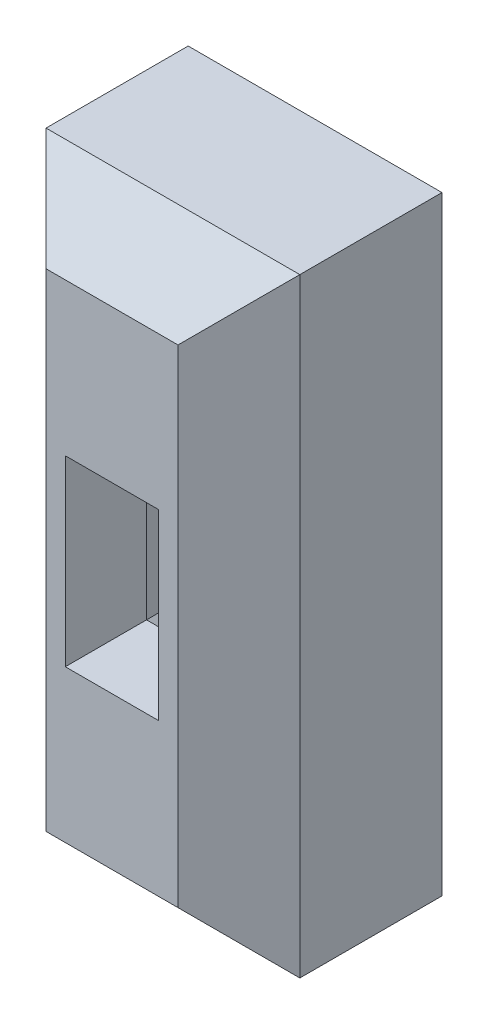
ISO-10303-21;
HEADER;
FILE_DESCRIPTION(('STEP AP214'),'2;1');
FILE_NAME('part.step','',(''),(''),'','','');
FILE_SCHEMA(('AUTOMOTIVE_DESIGN { 1 0 10303 214 1 1 1 1 }'));
ENDSEC;
DATA;
#1=APPLICATION_CONTEXT('core data for automotive mechanical design processes');
#2=APPLICATION_PROTOCOL_DEFINITION('international standard','automotive_design',2000,#1);
#3=PRODUCT_CONTEXT('',#1,'mechanical');
#4=PRODUCT('Part','Part','',(#3));
#5=PRODUCT_RELATED_PRODUCT_CATEGORY('part','',(#4));
#6=PRODUCT_DEFINITION_FORMATION('','',#4);
#7=PRODUCT_DEFINITION_CONTEXT('part definition',#1,'design');
#8=PRODUCT_DEFINITION('design','',#6,#7);
#9=PRODUCT_DEFINITION_SHAPE('','',#8);
#10=(LENGTH_UNIT() NAMED_UNIT(*) SI_UNIT(.MILLI.,.METRE.));
#11=(NAMED_UNIT(*) PLANE_ANGLE_UNIT() SI_UNIT($,.RADIAN.));
#12=(NAMED_UNIT(*) SI_UNIT($,.STERADIAN.) SOLID_ANGLE_UNIT());
#13=UNCERTAINTY_MEASURE_WITH_UNIT(LENGTH_MEASURE(1.E-05),#10,'distance_accuracy_value','');
#14=(GEOMETRIC_REPRESENTATION_CONTEXT(3) GLOBAL_UNCERTAINTY_ASSIGNED_CONTEXT((#13)) GLOBAL_UNIT_ASSIGNED_CONTEXT((#10,
#11,#12)) REPRESENTATION_CONTEXT('',''));
#15=CARTESIAN_POINT('',(0.,0.,0.));
#16=DIRECTION('',(0.,0.,1.));
#17=DIRECTION('',(1.,0.,0.));
#18=AXIS2_PLACEMENT_3D('',#15,#16,#17);
#19=CARTESIAN_POINT('',(6.25,-15.,10.));
#20=DIRECTION('',(-1.,0.,0.));
#21=DIRECTION('',(0.,0.,1.));
#22=AXIS2_PLACEMENT_3D('',#19,#20,#21);
#23=PLANE('',#22);
#24=DIRECTION('',(0.,0.,-1.));
#25=VECTOR('',#24,1.);
#26=CARTESIAN_POINT('',(6.25,15.,10.));
#27=LINE('',#26,#25);
#28=CARTESIAN_POINT('',(6.25,15.,6.99999999999999));
#29=VERTEX_POINT('',#28);
#30=CARTESIAN_POINT('',(6.25,15.,0.));
#31=VERTEX_POINT('',#30);
#32=EDGE_CURVE('E171',#29,#31,#27,.T.);
#33=ORIENTED_EDGE('',*,*,#32,.F.);
#34=DIRECTION('',(0.,-1.,0.));
#35=VECTOR('',#34,1.);
#36=CARTESIAN_POINT('',(6.25,-15.,6.99999999999999));
#37=LINE('',#36,#35);
#38=CARTESIAN_POINT('',(6.25,-15.,6.99999999999999));
#39=VERTEX_POINT('',#38);
#40=EDGE_CURVE('E182',#29,#39,#37,.T.);
#41=ORIENTED_EDGE('',*,*,#40,.T.);
#42=DIRECTION('',(0.,0.,-1.));
#43=VECTOR('',#42,1.);
#44=CARTESIAN_POINT('',(6.25,-15.,10.));
#45=LINE('',#44,#43);
#46=CARTESIAN_POINT('',(6.25,-15.,0.));
#47=VERTEX_POINT('',#46);
#48=EDGE_CURVE('E165',#39,#47,#45,.T.);
#49=ORIENTED_EDGE('',*,*,#48,.T.);
#50=DIRECTION('',(0.,1.,0.));
#51=VECTOR('',#50,1.);
#52=CARTESIAN_POINT('',(6.25,-15.,0.));
#53=LINE('',#52,#51);
#54=EDGE_CURVE('E151',#47,#31,#53,.T.);
#55=ORIENTED_EDGE('',*,*,#54,.T.);
#56=EDGE_LOOP('',(#33,#41,#49,#55));
#57=FACE_BOUND('',#56,.T.);
#58=ADVANCED_FACE('F35',(#57),#23,.F.);
#59=CARTESIAN_POINT('',(-6.25,15.,10.));
#60=DIRECTION('',(0.,-1.,0.));
#61=DIRECTION('',(0.,0.,-1.));
#62=AXIS2_PLACEMENT_3D('',#59,#60,#61);
#63=PLANE('',#62);
#64=DIRECTION('',(0.,0.,-1.));
#65=VECTOR('',#64,1.);
#66=CARTESIAN_POINT('',(-6.25,15.,10.));
#67=LINE('',#66,#65);
#68=CARTESIAN_POINT('',(-6.25,15.,6.99999999999999));
#69=VERTEX_POINT('',#68);
#70=CARTESIAN_POINT('',(-6.25,15.,0.));
#71=VERTEX_POINT('',#70);
#72=EDGE_CURVE('E169',#69,#71,#67,.T.);
#73=ORIENTED_EDGE('',*,*,#72,.F.);
#74=DIRECTION('',(1.,0.,0.));
#75=VECTOR('',#74,1.);
#76=CARTESIAN_POINT('',(-6.25,15.,6.99999999999999));
#77=LINE('',#76,#75);
#78=EDGE_CURVE('E187',#69,#29,#77,.T.);
#79=ORIENTED_EDGE('',*,*,#78,.T.);
#80=ORIENTED_EDGE('',*,*,#32,.T.);
#81=DIRECTION('',(-1.,0.,0.));
#82=VECTOR('',#81,1.);
#83=CARTESIAN_POINT('',(-6.25,15.,0.));
#84=LINE('',#83,#82);
#85=EDGE_CURVE('E156',#31,#71,#84,.T.);
#86=ORIENTED_EDGE('',*,*,#85,.T.);
#87=EDGE_LOOP('',(#73,#79,#80,#86));
#88=FACE_BOUND('',#87,.T.);
#89=ADVANCED_FACE('F263',(#88),#63,.F.);
#90=CARTESIAN_POINT('',(-6.25,-15.,10.));
#91=DIRECTION('',(1.,0.,0.));
#92=DIRECTION('',(0.,0.,-1.));
#93=AXIS2_PLACEMENT_3D('',#90,#91,#92);
#94=PLANE('',#93);
#95=DIRECTION('',(0.,0.,-1.));
#96=VECTOR('',#95,1.);
#97=CARTESIAN_POINT('',(-6.25,-15.,10.));
#98=LINE('',#97,#96);
#99=CARTESIAN_POINT('',(-6.25,-15.,6.99999999999999));
#100=VERTEX_POINT('',#99);
#101=CARTESIAN_POINT('',(-6.25,-15.,0.));
#102=VERTEX_POINT('',#101);
#103=EDGE_CURVE('E167',#100,#102,#98,.T.);
#104=ORIENTED_EDGE('',*,*,#103,.F.);
#105=DIRECTION('',(0.,1.,0.));
#106=VECTOR('',#105,1.);
#107=CARTESIAN_POINT('',(-6.25,-15.,6.99999999999999));
#108=LINE('',#107,#106);
#109=EDGE_CURVE('E189',#100,#69,#108,.T.);
#110=ORIENTED_EDGE('',*,*,#109,.T.);
#111=ORIENTED_EDGE('',*,*,#72,.T.);
#112=DIRECTION('',(0.,-1.,0.));
#113=VECTOR('',#112,1.);
#114=CARTESIAN_POINT('',(-6.25,-15.,0.));
#115=LINE('',#114,#113);
#116=EDGE_CURVE('E159',#71,#102,#115,.T.);
#117=ORIENTED_EDGE('',*,*,#116,.T.);
#118=EDGE_LOOP('',(#104,#110,#111,#117));
#119=FACE_BOUND('',#118,.T.);
#120=ADVANCED_FACE('F259',(#119),#94,.F.);
#121=CARTESIAN_POINT('',(-6.25,-15.,10.));
#122=DIRECTION('',(0.,1.,0.));
#123=DIRECTION('',(0.,0.,1.));
#124=AXIS2_PLACEMENT_3D('',#121,#122,#123);
#125=PLANE('',#124);
#126=ORIENTED_EDGE('',*,*,#48,.F.);
#127=DIRECTION('',(-1.,0.,0.));
#128=VECTOR('',#127,1.);
#129=CARTESIAN_POINT('',(-6.25,-15.,6.99999999999999));
#130=LINE('',#129,#128);
#131=EDGE_CURVE('E185',#39,#100,#130,.T.);
#132=ORIENTED_EDGE('',*,*,#131,.T.);
#133=ORIENTED_EDGE('',*,*,#103,.T.);
#134=DIRECTION('',(1.,0.,0.));
#135=VECTOR('',#134,1.);
#136=CARTESIAN_POINT('',(-6.25,-15.,0.));
#137=LINE('',#136,#135);
#138=EDGE_CURVE('E162',#102,#47,#137,.T.);
#139=ORIENTED_EDGE('',*,*,#138,.T.);
#140=EDGE_LOOP('',(#126,#132,#133,#139));
#141=FACE_BOUND('',#140,.T.);
#142=ADVANCED_FACE('F254',(#141),#125,.F.);
#143=CARTESIAN_POINT('',(0.,0.,10.));
#144=DIRECTION('',(0.,0.,-1.));
#145=DIRECTION('',(-1.,0.,0.));
#146=AXIS2_PLACEMENT_3D('',#143,#144,#145);
#147=PLANE('',#146);
#148=DIRECTION('',(1.,0.,0.));
#149=VECTOR('',#148,1.);
#150=CARTESIAN_POINT('',(0.,-12.,10.));
#151=LINE('',#150,#149);
#152=CARTESIAN_POINT('',(-3.25,-12.,10.));
#153=VERTEX_POINT('',#152);
#154=CARTESIAN_POINT('',(3.25,-12.,10.));
#155=VERTEX_POINT('',#154);
#156=EDGE_CURVE('E177',#153,#155,#151,.T.);
#157=ORIENTED_EDGE('',*,*,#156,.T.);
#158=DIRECTION('',(0.,1.,0.));
#159=VECTOR('',#158,1.);
#160=CARTESIAN_POINT('',(3.25,0.,10.));
#161=LINE('',#160,#159);
#162=CARTESIAN_POINT('',(3.25,12.,10.));
#163=VERTEX_POINT('',#162);
#164=EDGE_CURVE('E179',#155,#163,#161,.T.);
#165=ORIENTED_EDGE('',*,*,#164,.T.);
#166=DIRECTION('',(-1.,0.,0.));
#167=VECTOR('',#166,1.);
#168=CARTESIAN_POINT('',(0.,12.,10.));
#169=LINE('',#168,#167);
#170=CARTESIAN_POINT('',(-3.25,12.,10.));
#171=VERTEX_POINT('',#170);
#172=EDGE_CURVE('E175',#163,#171,#169,.T.);
#173=ORIENTED_EDGE('',*,*,#172,.T.);
#174=DIRECTION('',(0.,-1.,0.));
#175=VECTOR('',#174,1.);
#176=CARTESIAN_POINT('',(-3.25,0.,10.));
#177=LINE('',#176,#175);
#178=EDGE_CURVE('E173',#171,#153,#177,.T.);
#179=ORIENTED_EDGE('',*,*,#178,.T.);
#180=EDGE_LOOP('',(#157,#165,#173,#179));
#181=FACE_BOUND('',#180,.T.);
#182=DIRECTION('',(-1.,0.,0.));
#183=VECTOR('',#182,1.);
#184=CARTESIAN_POINT('',(-2.3,4.5,10.));
#185=LINE('',#184,#183);
#186=CARTESIAN_POINT('',(2.3,4.5,10.));
#187=VERTEX_POINT('',#186);
#188=CARTESIAN_POINT('',(-2.3,4.5,10.));
#189=VERTEX_POINT('',#188);
#190=EDGE_CURVE('E134',#187,#189,#185,.T.);
#191=ORIENTED_EDGE('',*,*,#190,.F.);
#192=DIRECTION('',(0.,1.,0.));
#193=VECTOR('',#192,1.);
#194=CARTESIAN_POINT('',(2.3,-4.5,10.));
#195=LINE('',#194,#193);
#196=CARTESIAN_POINT('',(2.3,-4.5,10.));
#197=VERTEX_POINT('',#196);
#198=EDGE_CURVE('E140',#197,#187,#195,.T.);
#199=ORIENTED_EDGE('',*,*,#198,.F.);
#200=DIRECTION('',(1.,0.,0.));
#201=VECTOR('',#200,1.);
#202=CARTESIAN_POINT('',(-2.3,-4.5,10.));
#203=LINE('',#202,#201);
#204=CARTESIAN_POINT('',(-2.3,-4.5,10.));
#205=VERTEX_POINT('',#204);
#206=EDGE_CURVE('E144',#205,#197,#203,.T.);
#207=ORIENTED_EDGE('',*,*,#206,.F.);
#208=DIRECTION('',(0.,-1.,0.));
#209=VECTOR('',#208,1.);
#210=CARTESIAN_POINT('',(-2.3,-4.5,10.));
#211=LINE('',#210,#209);
#212=EDGE_CURVE('E126',#189,#205,#211,.T.);
#213=ORIENTED_EDGE('',*,*,#212,.F.);
#214=EDGE_LOOP('',(#191,#199,#207,#213));
#215=FACE_BOUND('',#214,.T.);
#216=ADVANCED_FACE('F142',(#181,#215),#147,.F.);
#217=CARTESIAN_POINT('',(0.,0.,0.));
#218=DIRECTION('',(0.,0.,-1.));
#219=DIRECTION('',(-1.,0.,0.));
#220=AXIS2_PLACEMENT_3D('',#217,#218,#219);
#221=PLANE('',#220);
#222=DIRECTION('',(1.,0.,0.));
#223=VECTOR('',#222,1.);
#224=CARTESIAN_POINT('',(2.3,-7.29784594892999,0.));
#225=LINE('',#224,#223);
#226=CARTESIAN_POINT('',(-5.09784594892999,-7.29784594892999,0.));
#227=VERTEX_POINT('',#226);
#228=CARTESIAN_POINT('',(5.09784594892999,-7.29784594892999,0.));
#229=VERTEX_POINT('',#228);
#230=EDGE_CURVE('E191',#227,#229,#225,.T.);
#231=ORIENTED_EDGE('',*,*,#230,.T.);
#232=DIRECTION('',(0.,1.,0.));
#233=VECTOR('',#232,1.);
#234=CARTESIAN_POINT('',(5.09784594892999,4.5,0.));
#235=LINE('',#234,#233);
#236=CARTESIAN_POINT('',(5.09784594892999,7.29784594892999,0.));
#237=VERTEX_POINT('',#236);
#238=EDGE_CURVE('E207',#229,#237,#235,.T.);
#239=ORIENTED_EDGE('',*,*,#238,.T.);
#240=DIRECTION('',(-1.,0.,0.));
#241=VECTOR('',#240,1.);
#242=CARTESIAN_POINT('',(-2.3,7.29784594892999,0.));
#243=LINE('',#242,#241);
#244=CARTESIAN_POINT('',(-5.09784594892999,7.29784594892999,0.));
#245=VERTEX_POINT('',#244);
#246=EDGE_CURVE('E205',#237,#245,#243,.T.);
#247=ORIENTED_EDGE('',*,*,#246,.T.);
#248=DIRECTION('',(0.,-1.,0.));
#249=VECTOR('',#248,1.);
#250=CARTESIAN_POINT('',(-5.09784594892999,-4.5,0.));
#251=LINE('',#250,#249);
#252=EDGE_CURVE('E203',#245,#227,#251,.T.);
#253=ORIENTED_EDGE('',*,*,#252,.T.);
#254=EDGE_LOOP('',(#231,#239,#247,#253));
#255=FACE_BOUND('',#254,.T.);
#256=ORIENTED_EDGE('',*,*,#54,.F.);
#257=ORIENTED_EDGE('',*,*,#138,.F.);
#258=ORIENTED_EDGE('',*,*,#116,.F.);
#259=ORIENTED_EDGE('',*,*,#85,.F.);
#260=EDGE_LOOP('',(#256,#257,#258,#259));
#261=FACE_BOUND('',#260,.T.);
#262=ADVANCED_FACE('F241',(#255,#261),#221,.T.);
#263=CARTESIAN_POINT('',(2.3,-4.5,0.));
#264=DIRECTION('',(1.,0.,0.));
#265=DIRECTION('',(0.,0.,-1.));
#266=AXIS2_PLACEMENT_3D('',#263,#264,#265);
#267=PLANE('',#266);
#268=DIRECTION('',(0.,0.,1.));
#269=VECTOR('',#268,1.);
#270=CARTESIAN_POINT('',(2.3,4.5,0.));
#271=LINE('',#270,#269);
#272=CARTESIAN_POINT('',(2.3,4.5,6.00000000000005));
#273=VERTEX_POINT('',#272);
#274=EDGE_CURVE('E131',#273,#187,#271,.T.);
#275=ORIENTED_EDGE('',*,*,#274,.F.);
#276=DIRECTION('',(0.,-1.,0.));
#277=VECTOR('',#276,1.);
#278=CARTESIAN_POINT('',(2.3,-4.5,6.00000000000005));
#279=LINE('',#278,#277);
#280=CARTESIAN_POINT('',(2.3,-4.5,6.00000000000005));
#281=VERTEX_POINT('',#280);
#282=EDGE_CURVE('E210',#273,#281,#279,.T.);
#283=ORIENTED_EDGE('',*,*,#282,.T.);
#284=DIRECTION('',(0.,0.,1.));
#285=VECTOR('',#284,1.);
#286=CARTESIAN_POINT('',(2.3,-4.5,0.));
#287=LINE('',#286,#285);
#288=EDGE_CURVE('E149',#281,#197,#287,.T.);
#289=ORIENTED_EDGE('',*,*,#288,.T.);
#290=ORIENTED_EDGE('',*,*,#198,.T.);
#291=EDGE_LOOP('',(#275,#283,#289,#290));
#292=FACE_BOUND('',#291,.T.);
#293=ADVANCED_FACE('F236',(#292),#267,.F.);
#294=CARTESIAN_POINT('',(-2.3,-4.5,0.));
#295=DIRECTION('',(0.,-1.,0.));
#296=DIRECTION('',(0.,0.,-1.));
#297=AXIS2_PLACEMENT_3D('',#294,#295,#296);
#298=PLANE('',#297);
#299=ORIENTED_EDGE('',*,*,#288,.F.);
#300=DIRECTION('',(-1.,0.,0.));
#301=VECTOR('',#300,1.);
#302=CARTESIAN_POINT('',(-2.3,-4.5,6.00000000000005));
#303=LINE('',#302,#301);
#304=CARTESIAN_POINT('',(-2.3,-4.5,6.00000000000005));
#305=VERTEX_POINT('',#304);
#306=EDGE_CURVE('E11',#281,#305,#303,.T.);
#307=ORIENTED_EDGE('',*,*,#306,.T.);
#308=DIRECTION('',(0.,0.,1.));
#309=VECTOR('',#308,1.);
#310=CARTESIAN_POINT('',(-2.3,-4.5,0.));
#311=LINE('',#310,#309);
#312=EDGE_CURVE('E130',#305,#205,#311,.T.);
#313=ORIENTED_EDGE('',*,*,#312,.T.);
#314=ORIENTED_EDGE('',*,*,#206,.T.);
#315=EDGE_LOOP('',(#299,#307,#313,#314));
#316=FACE_BOUND('',#315,.T.);
#317=ADVANCED_FACE('F342',(#316),#298,.F.);
#318=CARTESIAN_POINT('',(-2.3,-4.5,0.));
#319=DIRECTION('',(-1.,0.,0.));
#320=DIRECTION('',(0.,0.,1.));
#321=AXIS2_PLACEMENT_3D('',#318,#319,#320);
#322=PLANE('',#321);
#323=ORIENTED_EDGE('',*,*,#312,.F.);
#324=DIRECTION('',(0.,1.,0.));
#325=VECTOR('',#324,1.);
#326=CARTESIAN_POINT('',(-2.3,4.5,6.00000000000005));
#327=LINE('',#326,#325);
#328=CARTESIAN_POINT('',(-2.3,4.5,6.00000000000005));
#329=VERTEX_POINT('',#328);
#330=EDGE_CURVE('E44',#305,#329,#327,.T.);
#331=ORIENTED_EDGE('',*,*,#330,.T.);
#332=DIRECTION('',(0.,0.,1.));
#333=VECTOR('',#332,1.);
#334=CARTESIAN_POINT('',(-2.3,4.5,0.));
#335=LINE('',#334,#333);
#336=EDGE_CURVE('E122',#329,#189,#335,.T.);
#337=ORIENTED_EDGE('',*,*,#336,.T.);
#338=ORIENTED_EDGE('',*,*,#212,.T.);
#339=EDGE_LOOP('',(#323,#331,#337,#338));
#340=FACE_BOUND('',#339,.T.);
#341=ADVANCED_FACE('F124',(#340),#322,.F.);
#342=CARTESIAN_POINT('',(-2.3,4.5,0.));
#343=DIRECTION('',(0.,1.,0.));
#344=DIRECTION('',(0.,0.,1.));
#345=AXIS2_PLACEMENT_3D('',#342,#343,#344);
#346=PLANE('',#345);
#347=ORIENTED_EDGE('',*,*,#336,.F.);
#348=DIRECTION('',(1.,0.,0.));
#349=VECTOR('',#348,1.);
#350=CARTESIAN_POINT('',(2.3,4.5,6.00000000000005));
#351=LINE('',#350,#349);
#352=EDGE_CURVE('E213',#329,#273,#351,.T.);
#353=ORIENTED_EDGE('',*,*,#352,.T.);
#354=ORIENTED_EDGE('',*,*,#274,.T.);
#355=ORIENTED_EDGE('',*,*,#190,.T.);
#356=EDGE_LOOP('',(#347,#353,#354,#355));
#357=FACE_BOUND('',#356,.T.);
#358=ADVANCED_FACE('F135',(#357),#346,.F.);
#359=CARTESIAN_POINT('',(-3.25,0.,10.));
#360=DIRECTION('',(0.707106781186549,0.,-0.707106781186546));
#361=DIRECTION('',(0.,-1.,0.));
#362=AXIS2_PLACEMENT_3D('',#359,#360,#361);
#363=PLANE('',#362);
#364=DIRECTION('',(-0.577350269189625,0.577350269189625,-0.577350269189627));
#365=VECTOR('',#364,1.);
#366=CARTESIAN_POINT('',(0.749999999999991,8.00000000000001,14.));
#367=LINE('',#366,#365);
#368=EDGE_CURVE('E196',#69,#171,#367,.F.);
#369=ORIENTED_EDGE('',*,*,#368,.F.);
#370=ORIENTED_EDGE('',*,*,#109,.F.);
#371=DIRECTION('',(0.577350269189625,0.577350269189625,0.577350269189627));
#372=VECTOR('',#371,1.);
#373=CARTESIAN_POINT('',(0.749999999999991,-8.00000000000001,14.));
#374=LINE('',#373,#372);
#375=EDGE_CURVE('E199',#153,#100,#374,.F.);
#376=ORIENTED_EDGE('',*,*,#375,.F.);
#377=ORIENTED_EDGE('',*,*,#178,.F.);
#378=EDGE_LOOP('',(#369,#370,#376,#377));
#379=FACE_BOUND('',#378,.T.);
#380=ADVANCED_FACE('F279',(#379),#363,.F.);
#381=CARTESIAN_POINT('',(0.,-12.,10.));
#382=DIRECTION('',(0.,0.707106781186549,-0.707106781186546));
#383=DIRECTION('',(1.,0.,0.));
#384=AXIS2_PLACEMENT_3D('',#381,#382,#383);
#385=PLANE('',#384);
#386=ORIENTED_EDGE('',*,*,#375,.T.);
#387=ORIENTED_EDGE('',*,*,#131,.F.);
#388=DIRECTION('',(-0.577350269189625,0.577350269189625,0.577350269189627));
#389=VECTOR('',#388,1.);
#390=CARTESIAN_POINT('',(2.16666666666667,-10.9166666666667,11.0833333333333));
#391=LINE('',#390,#389);
#392=EDGE_CURVE('E194',#155,#39,#391,.F.);
#393=ORIENTED_EDGE('',*,*,#392,.F.);
#394=ORIENTED_EDGE('',*,*,#156,.F.);
#395=EDGE_LOOP('',(#386,#387,#393,#394));
#396=FACE_BOUND('',#395,.T.);
#397=ADVANCED_FACE('F275',(#396),#385,.F.);
#398=CARTESIAN_POINT('',(0.,12.,10.));
#399=DIRECTION('',(0.,-0.707106781186549,-0.707106781186546));
#400=DIRECTION('',(-1.,0.,0.));
#401=AXIS2_PLACEMENT_3D('',#398,#399,#400);
#402=PLANE('',#401);
#403=ORIENTED_EDGE('',*,*,#368,.T.);
#404=ORIENTED_EDGE('',*,*,#172,.F.);
#405=DIRECTION('',(0.577350269189625,0.577350269189625,-0.577350269189627));
#406=VECTOR('',#405,1.);
#407=CARTESIAN_POINT('',(2.16666666666667,10.9166666666667,11.0833333333333));
#408=LINE('',#407,#406);
#409=EDGE_CURVE('E192',#29,#163,#408,.F.);
#410=ORIENTED_EDGE('',*,*,#409,.F.);
#411=ORIENTED_EDGE('',*,*,#78,.F.);
#412=EDGE_LOOP('',(#403,#404,#410,#411));
#413=FACE_BOUND('',#412,.T.);
#414=ADVANCED_FACE('F267',(#413),#402,.F.);
#415=CARTESIAN_POINT('',(3.25,0.,10.));
#416=DIRECTION('',(-0.707106781186549,0.,-0.707106781186546));
#417=DIRECTION('',(0.,1.,0.));
#418=AXIS2_PLACEMENT_3D('',#415,#416,#417);
#419=PLANE('',#418);
#420=ORIENTED_EDGE('',*,*,#392,.T.);
#421=ORIENTED_EDGE('',*,*,#40,.F.);
#422=ORIENTED_EDGE('',*,*,#409,.T.);
#423=ORIENTED_EDGE('',*,*,#164,.F.);
#424=EDGE_LOOP('',(#420,#421,#422,#423));
#425=FACE_BOUND('',#424,.T.);
#426=ADVANCED_FACE('F271',(#425),#419,.F.);
#427=CARTESIAN_POINT('',(-5.09784594892999,0.,0.));
#428=DIRECTION('',(0.906307787036651,0.,-0.422618261740697));
#429=DIRECTION('',(0.,1.,0.));
#430=AXIS2_PLACEMENT_3D('',#427,#428,#429);
#431=PLANE('',#430);
#432=DIRECTION('',(0.389281620635023,-0.389281620635023,0.83481712947899));
#433=VECTOR('',#432,1.);
#434=CARTESIAN_POINT('',(-4.32531745537965,6.52531745537965,1.65669270070954));
#435=LINE('',#434,#433);
#436=EDGE_CURVE('E219',#329,#245,#435,.F.);
#437=ORIENTED_EDGE('',*,*,#436,.F.);
#438=ORIENTED_EDGE('',*,*,#330,.F.);
#439=DIRECTION('',(0.389281620635023,0.389281620635023,0.83481712947899));
#440=VECTOR('',#439,1.);
#441=CARTESIAN_POINT('',(-3.99192905901835,-6.19192905901835,2.37164642392395));
#442=LINE('',#441,#440);
#443=EDGE_CURVE('E39',#227,#305,#442,.T.);
#444=ORIENTED_EDGE('',*,*,#443,.F.);
#445=ORIENTED_EDGE('',*,*,#252,.F.);
#446=EDGE_LOOP('',(#437,#438,#444,#445));
#447=FACE_BOUND('',#446,.T.);
#448=ADVANCED_FACE('F37',(#447),#431,.T.);
#449=CARTESIAN_POINT('',(0.,-7.29784594892999,0.));
#450=DIRECTION('',(0.,0.906307787036651,-0.422618261740697));
#451=DIRECTION('',(-1.,0.,0.));
#452=AXIS2_PLACEMENT_3D('',#449,#450,#451);
#453=PLANE('',#452);
#454=ORIENTED_EDGE('',*,*,#443,.T.);
#455=ORIENTED_EDGE('',*,*,#306,.F.);
#456=DIRECTION('',(0.389281620635023,-0.389281620635023,-0.83481712947899));
#457=VECTOR('',#456,1.);
#458=CARTESIAN_POINT('',(3.99192905901835,-6.19192905901835,2.37164642392395));
#459=LINE('',#458,#457);
#460=EDGE_CURVE('E218',#229,#281,#459,.F.);
#461=ORIENTED_EDGE('',*,*,#460,.F.);
#462=ORIENTED_EDGE('',*,*,#230,.F.);
#463=EDGE_LOOP('',(#454,#455,#461,#462));
#464=FACE_BOUND('',#463,.T.);
#465=ADVANCED_FACE('F228',(#464),#453,.T.);
#466=CARTESIAN_POINT('',(0.,7.29784594892999,0.));
#467=DIRECTION('',(0.,-0.906307787036651,-0.422618261740697));
#468=DIRECTION('',(1.,0.,0.));
#469=AXIS2_PLACEMENT_3D('',#466,#467,#468);
#470=PLANE('',#469);
#471=ORIENTED_EDGE('',*,*,#436,.T.);
#472=ORIENTED_EDGE('',*,*,#246,.F.);
#473=DIRECTION('',(-0.389281620635023,-0.389281620635023,0.83481712947899));
#474=VECTOR('',#473,1.);
#475=CARTESIAN_POINT('',(3.99192905901835,6.19192905901834,2.37164642392395));
#476=LINE('',#475,#474);
#477=EDGE_CURVE('E216',#273,#237,#476,.F.);
#478=ORIENTED_EDGE('',*,*,#477,.F.);
#479=ORIENTED_EDGE('',*,*,#352,.F.);
#480=EDGE_LOOP('',(#471,#472,#478,#479));
#481=FACE_BOUND('',#480,.T.);
#482=ADVANCED_FACE('F233',(#481),#470,.T.);
#483=CARTESIAN_POINT('',(5.09784594892999,0.,0.));
#484=DIRECTION('',(-0.906307787036651,0.,-0.422618261740697));
#485=DIRECTION('',(0.,-1.,0.));
#486=AXIS2_PLACEMENT_3D('',#483,#484,#485);
#487=PLANE('',#486);
#488=ORIENTED_EDGE('',*,*,#460,.T.);
#489=ORIENTED_EDGE('',*,*,#282,.F.);
#490=ORIENTED_EDGE('',*,*,#477,.T.);
#491=ORIENTED_EDGE('',*,*,#238,.F.);
#492=EDGE_LOOP('',(#488,#489,#490,#491));
#493=FACE_BOUND('',#492,.T.);
#494=ADVANCED_FACE('F238',(#493),#487,.T.);
#495=CLOSED_SHELL('',(#58,#89,#120,#142,#216,#262,#293,#317,#341,#358,#380,#397,#414,#426,#448,
#465,#482,#494));
#496=MANIFOLD_SOLID_BREP('B2',#495);
#497=ADVANCED_BREP_SHAPE_REPRESENTATION('',(#18,#496),#14);
#498=SHAPE_DEFINITION_REPRESENTATION(#9,#497);
ENDSEC;
END-ISO-10303-21;
